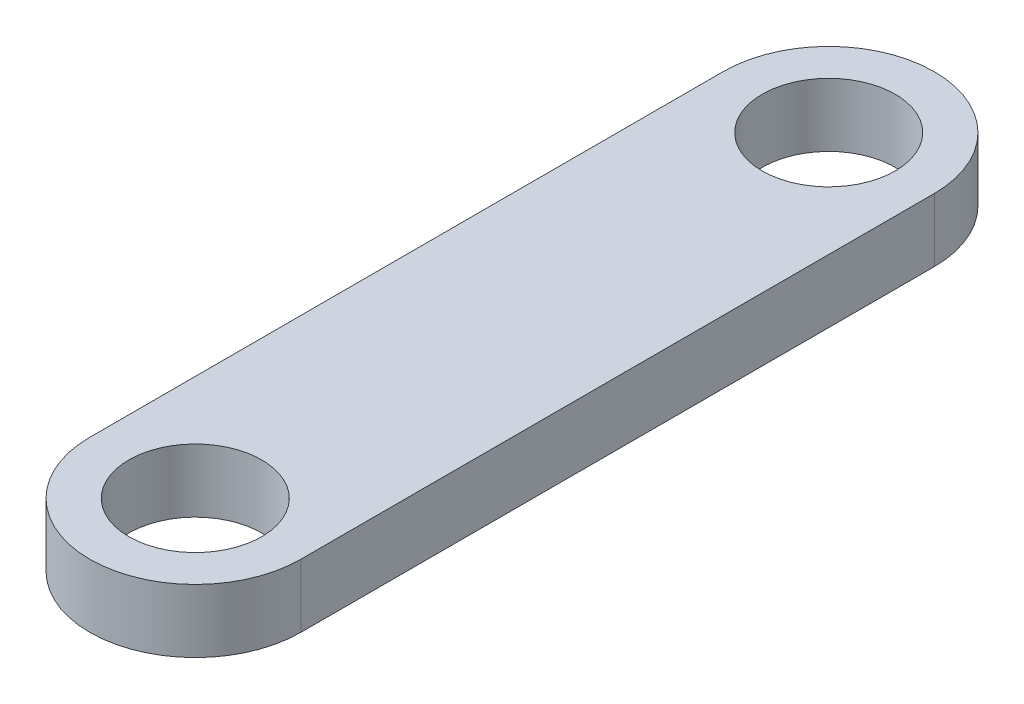
ISO-10303-21;
HEADER;
FILE_DESCRIPTION(('STEP AP214'),'2;1');
FILE_NAME('part.step','',(''),(''),'','','');
FILE_SCHEMA(('AUTOMOTIVE_DESIGN { 1 0 10303 214 1 1 1 1 }'));
ENDSEC;
DATA;
#1=APPLICATION_CONTEXT('core data for automotive mechanical design processes');
#2=APPLICATION_PROTOCOL_DEFINITION('international standard','automotive_design',2000,#1);
#3=PRODUCT_CONTEXT('',#1,'mechanical');
#4=PRODUCT('Part','Part','',(#3));
#5=PRODUCT_RELATED_PRODUCT_CATEGORY('part','',(#4));
#6=PRODUCT_DEFINITION_FORMATION('','',#4);
#7=PRODUCT_DEFINITION_CONTEXT('part definition',#1,'design');
#8=PRODUCT_DEFINITION('design','',#6,#7);
#9=PRODUCT_DEFINITION_SHAPE('','',#8);
#10=(LENGTH_UNIT() NAMED_UNIT(*) SI_UNIT(.MILLI.,.METRE.));
#11=(NAMED_UNIT(*) PLANE_ANGLE_UNIT() SI_UNIT($,.RADIAN.));
#12=(NAMED_UNIT(*) SI_UNIT($,.STERADIAN.) SOLID_ANGLE_UNIT());
#13=UNCERTAINTY_MEASURE_WITH_UNIT(LENGTH_MEASURE(1.E-05),#10,'distance_accuracy_value','');
#14=(GEOMETRIC_REPRESENTATION_CONTEXT(3) GLOBAL_UNCERTAINTY_ASSIGNED_CONTEXT((#13)) GLOBAL_UNIT_ASSIGNED_CONTEXT((#10,
#11,#12)) REPRESENTATION_CONTEXT('',''));
#15=CARTESIAN_POINT('',(0.,0.,0.));
#16=DIRECTION('',(0.,0.,1.));
#17=DIRECTION('',(1.,0.,0.));
#18=AXIS2_PLACEMENT_3D('',#15,#16,#17);
#19=CARTESIAN_POINT('',(0.,-1.905,19.05));
#20=DIRECTION('',(0.,1.,0.));
#21=DIRECTION('',(0.,0.,1.));
#22=AXIS2_PLACEMENT_3D('',#19,#20,#21);
#23=CYLINDRICAL_SURFACE('',#22,3.175);
#24=CARTESIAN_POINT('',(0.,0.,19.05));
#25=DIRECTION('',(0.,1.,0.));
#26=DIRECTION('',(0.,0.,-1.));
#27=AXIS2_PLACEMENT_3D('',#24,#25,#26);
#28=CIRCLE('',#27,3.175);
#29=CARTESIAN_POINT('',(-3.175,0.,19.05));
#30=VERTEX_POINT('',#29);
#31=CARTESIAN_POINT('',(3.175,0.,19.05));
#32=VERTEX_POINT('',#31);
#33=EDGE_CURVE('E110',#30,#32,#28,.T.);
#34=ORIENTED_EDGE('',*,*,#33,.F.);
#35=DIRECTION('',(0.,1.,0.));
#36=VECTOR('',#35,1.);
#37=CARTESIAN_POINT('',(-3.175,-1.905,19.05));
#38=LINE('',#37,#36);
#39=CARTESIAN_POINT('',(-3.175,-1.905,19.05));
#40=VERTEX_POINT('',#39);
#41=EDGE_CURVE('E11',#40,#30,#38,.T.);
#42=ORIENTED_EDGE('',*,*,#41,.F.);
#43=CARTESIAN_POINT('',(0.,-1.905,19.05));
#44=DIRECTION('',(0.,1.,0.));
#45=DIRECTION('',(0.,0.,-1.));
#46=AXIS2_PLACEMENT_3D('',#43,#44,#45);
#47=CIRCLE('',#46,3.175);
#48=CARTESIAN_POINT('',(3.175,-1.905,19.05));
#49=VERTEX_POINT('',#48);
#50=EDGE_CURVE('E101',#40,#49,#47,.T.);
#51=ORIENTED_EDGE('',*,*,#50,.T.);
#52=DIRECTION('',(0.,1.,0.));
#53=VECTOR('',#52,1.);
#54=CARTESIAN_POINT('',(3.175,-1.905,19.05));
#55=LINE('',#54,#53);
#56=EDGE_CURVE('E42',#49,#32,#55,.T.);
#57=ORIENTED_EDGE('',*,*,#56,.T.);
#58=EDGE_LOOP('',(#34,#42,#51,#57));
#59=FACE_BOUND('',#58,.T.);
#60=ADVANCED_FACE('F39',(#59),#23,.T.);
#61=CARTESIAN_POINT('',(-3.175,-1.905,19.05));
#62=DIRECTION('',(-1.,0.,0.));
#63=DIRECTION('',(0.,0.,1.));
#64=AXIS2_PLACEMENT_3D('',#61,#62,#63);
#65=PLANE('',#64);
#66=DIRECTION('',(0.,0.,1.));
#67=VECTOR('',#66,1.);
#68=CARTESIAN_POINT('',(-3.175,0.,19.05));
#69=LINE('',#68,#67);
#70=CARTESIAN_POINT('',(-3.175,0.,0.));
#71=VERTEX_POINT('',#70);
#72=EDGE_CURVE('E104',#71,#30,#69,.T.);
#73=ORIENTED_EDGE('',*,*,#72,.F.);
#74=DIRECTION('',(0.,1.,0.));
#75=VECTOR('',#74,1.);
#76=CARTESIAN_POINT('',(-3.175,-1.905,0.));
#77=LINE('',#76,#75);
#78=CARTESIAN_POINT('',(-3.175,-1.905,0.));
#79=VERTEX_POINT('',#78);
#80=EDGE_CURVE('E49',#79,#71,#77,.T.);
#81=ORIENTED_EDGE('',*,*,#80,.F.);
#82=DIRECTION('',(0.,0.,1.));
#83=VECTOR('',#82,1.);
#84=CARTESIAN_POINT('',(-3.175,-1.905,19.05));
#85=LINE('',#84,#83);
#86=EDGE_CURVE('E96',#79,#40,#85,.T.);
#87=ORIENTED_EDGE('',*,*,#86,.T.);
#88=ORIENTED_EDGE('',*,*,#41,.T.);
#89=EDGE_LOOP('',(#73,#81,#87,#88));
#90=FACE_BOUND('',#89,.T.);
#91=ADVANCED_FACE('F127',(#90),#65,.T.);
#92=CARTESIAN_POINT('',(0.,-1.905,0.));
#93=DIRECTION('',(0.,1.,0.));
#94=DIRECTION('',(0.,0.,1.));
#95=AXIS2_PLACEMENT_3D('',#92,#93,#94);
#96=CYLINDRICAL_SURFACE('',#95,3.175);
#97=CARTESIAN_POINT('',(0.,0.,0.));
#98=DIRECTION('',(0.,1.,0.));
#99=DIRECTION('',(0.,0.,1.));
#100=AXIS2_PLACEMENT_3D('',#97,#98,#99);
#101=CIRCLE('',#100,3.175);
#102=CARTESIAN_POINT('',(3.175,0.,0.));
#103=VERTEX_POINT('',#102);
#104=EDGE_CURVE('E90',#103,#71,#101,.T.);
#105=ORIENTED_EDGE('',*,*,#104,.F.);
#106=DIRECTION('',(0.,1.,0.));
#107=VECTOR('',#106,1.);
#108=CARTESIAN_POINT('',(3.175,-1.905,0.));
#109=LINE('',#108,#107);
#110=CARTESIAN_POINT('',(3.175,-1.905,0.));
#111=VERTEX_POINT('',#110);
#112=EDGE_CURVE('E85',#111,#103,#109,.T.);
#113=ORIENTED_EDGE('',*,*,#112,.F.);
#114=CARTESIAN_POINT('',(0.,-1.905,0.));
#115=DIRECTION('',(0.,1.,0.));
#116=DIRECTION('',(0.,0.,1.));
#117=AXIS2_PLACEMENT_3D('',#114,#115,#116);
#118=CIRCLE('',#117,3.175);
#119=EDGE_CURVE('E88',#111,#79,#118,.T.);
#120=ORIENTED_EDGE('',*,*,#119,.T.);
#121=ORIENTED_EDGE('',*,*,#80,.T.);
#122=EDGE_LOOP('',(#105,#113,#120,#121));
#123=FACE_BOUND('',#122,.T.);
#124=ADVANCED_FACE('F87',(#123),#96,.T.);
#125=CARTESIAN_POINT('',(3.175,-1.905,19.05));
#126=DIRECTION('',(1.,0.,0.));
#127=DIRECTION('',(0.,0.,-1.));
#128=AXIS2_PLACEMENT_3D('',#125,#126,#127);
#129=PLANE('',#128);
#130=DIRECTION('',(0.,0.,-1.));
#131=VECTOR('',#130,1.);
#132=CARTESIAN_POINT('',(3.175,0.,19.05));
#133=LINE('',#132,#131);
#134=EDGE_CURVE('E114',#32,#103,#133,.T.);
#135=ORIENTED_EDGE('',*,*,#134,.F.);
#136=ORIENTED_EDGE('',*,*,#56,.F.);
#137=DIRECTION('',(0.,0.,-1.));
#138=VECTOR('',#137,1.);
#139=CARTESIAN_POINT('',(3.175,-1.905,19.05));
#140=LINE('',#139,#138);
#141=EDGE_CURVE('E95',#49,#111,#140,.T.);
#142=ORIENTED_EDGE('',*,*,#141,.T.);
#143=ORIENTED_EDGE('',*,*,#112,.T.);
#144=EDGE_LOOP('',(#135,#136,#142,#143));
#145=FACE_BOUND('',#144,.T.);
#146=ADVANCED_FACE('F99',(#145),#129,.T.);
#147=CARTESIAN_POINT('',(0.,-1.905,19.05));
#148=DIRECTION('',(0.,-1.,0.));
#149=DIRECTION('',(0.,0.,-1.));
#150=AXIS2_PLACEMENT_3D('',#147,#148,#149);
#151=PLANE('',#150);
#152=CARTESIAN_POINT('',(0.,-1.905,19.05));
#153=DIRECTION('',(0.,1.,0.));
#154=DIRECTION('',(0.,0.,1.));
#155=AXIS2_PLACEMENT_3D('',#152,#153,#154);
#156=CIRCLE('',#155,2.);
#157=CARTESIAN_POINT('',(0.,-1.905,21.05));
#158=VERTEX_POINT('',#157);
#159=EDGE_CURVE('E160',#158,#158,#156,.T.);
#160=ORIENTED_EDGE('',*,*,#159,.T.);
#161=EDGE_LOOP('',(#160));
#162=FACE_BOUND('',#161,.T.);
#163=CARTESIAN_POINT('',(0.,-1.905,0.));
#164=DIRECTION('',(0.,1.,0.));
#165=DIRECTION('',(0.,0.,1.));
#166=AXIS2_PLACEMENT_3D('',#163,#164,#165);
#167=CIRCLE('',#166,2.);
#168=CARTESIAN_POINT('',(0.,-1.905,2.));
#169=VERTEX_POINT('',#168);
#170=EDGE_CURVE('E115',#169,#169,#167,.T.);
#171=ORIENTED_EDGE('',*,*,#170,.T.);
#172=EDGE_LOOP('',(#171));
#173=FACE_BOUND('',#172,.T.);
#174=ORIENTED_EDGE('',*,*,#50,.F.);
#175=ORIENTED_EDGE('',*,*,#86,.F.);
#176=ORIENTED_EDGE('',*,*,#119,.F.);
#177=ORIENTED_EDGE('',*,*,#141,.F.);
#178=EDGE_LOOP('',(#174,#175,#176,#177));
#179=FACE_BOUND('',#178,.T.);
#180=ADVANCED_FACE('F94',(#162,#173,#179),#151,.T.);
#181=CARTESIAN_POINT('',(0.,0.,19.05));
#182=DIRECTION('',(0.,-1.,0.));
#183=DIRECTION('',(0.,0.,-1.));
#184=AXIS2_PLACEMENT_3D('',#181,#182,#183);
#185=PLANE('',#184);
#186=CARTESIAN_POINT('',(0.,0.,19.05));
#187=DIRECTION('',(0.,1.,0.));
#188=DIRECTION('',(0.,0.,1.));
#189=AXIS2_PLACEMENT_3D('',#186,#187,#188);
#190=CIRCLE('',#189,2.);
#191=CARTESIAN_POINT('',(0.,0.,21.05));
#192=VERTEX_POINT('',#191);
#193=EDGE_CURVE('E163',#192,#192,#190,.T.);
#194=ORIENTED_EDGE('',*,*,#193,.F.);
#195=EDGE_LOOP('',(#194));
#196=FACE_BOUND('',#195,.T.);
#197=CARTESIAN_POINT('',(0.,0.,0.));
#198=DIRECTION('',(0.,1.,0.));
#199=DIRECTION('',(0.,0.,1.));
#200=AXIS2_PLACEMENT_3D('',#197,#198,#199);
#201=CIRCLE('',#200,2.);
#202=CARTESIAN_POINT('',(0.,0.,2.));
#203=VERTEX_POINT('',#202);
#204=EDGE_CURVE('E167',#203,#203,#201,.T.);
#205=ORIENTED_EDGE('',*,*,#204,.F.);
#206=EDGE_LOOP('',(#205));
#207=FACE_BOUND('',#206,.T.);
#208=ORIENTED_EDGE('',*,*,#33,.T.);
#209=ORIENTED_EDGE('',*,*,#134,.T.);
#210=ORIENTED_EDGE('',*,*,#104,.T.);
#211=ORIENTED_EDGE('',*,*,#72,.T.);
#212=EDGE_LOOP('',(#208,#209,#210,#211));
#213=FACE_BOUND('',#212,.T.);
#214=ADVANCED_FACE('F126',(#196,#207,#213),#185,.F.);
#215=CARTESIAN_POINT('',(0.,-1.905,0.));
#216=DIRECTION('',(0.,1.,0.));
#217=DIRECTION('',(0.,0.,1.));
#218=AXIS2_PLACEMENT_3D('',#215,#216,#217);
#219=CYLINDRICAL_SURFACE('',#218,2.);
#220=CARTESIAN_POINT('',(0.,-1.905,2.));
#221=CARTESIAN_POINT('',(0.,-1.88515625,2.));
#222=CARTESIAN_POINT('',(0.,-1.8653125,2.));
#223=CARTESIAN_POINT('',(0.,-1.825625,2.));
#224=CARTESIAN_POINT('',(0.,-1.80578125,2.));
#225=CARTESIAN_POINT('',(0.,-1.76609375,2.));
#226=CARTESIAN_POINT('',(0.,-1.74625,2.));
#227=CARTESIAN_POINT('',(0.,-1.7065625,2.));
#228=CARTESIAN_POINT('',(0.,-1.68671875,2.));
#229=CARTESIAN_POINT('',(0.,-1.64703125,2.));
#230=CARTESIAN_POINT('',(0.,-1.6271875,2.));
#231=CARTESIAN_POINT('',(0.,-1.5875,2.));
#232=CARTESIAN_POINT('',(0.,-1.56765625,2.));
#233=CARTESIAN_POINT('',(0.,-1.52796875,2.));
#234=CARTESIAN_POINT('',(0.,-1.508125,2.));
#235=CARTESIAN_POINT('',(0.,-1.4684375,2.));
#236=CARTESIAN_POINT('',(0.,-1.44859375,2.));
#237=CARTESIAN_POINT('',(0.,-1.40890625,2.));
#238=CARTESIAN_POINT('',(0.,-1.3890625,2.));
#239=CARTESIAN_POINT('',(0.,-1.349375,2.));
#240=CARTESIAN_POINT('',(0.,-1.32953125,2.));
#241=CARTESIAN_POINT('',(0.,-1.28984375,2.));
#242=CARTESIAN_POINT('',(0.,-1.27,2.));
#243=CARTESIAN_POINT('',(0.,-1.2303125,2.));
#244=CARTESIAN_POINT('',(0.,-1.21046875,2.));
#245=CARTESIAN_POINT('',(0.,-1.17078125,2.));
#246=CARTESIAN_POINT('',(0.,-1.1509375,2.));
#247=CARTESIAN_POINT('',(0.,-1.11125,2.));
#248=CARTESIAN_POINT('',(0.,-1.09140625,2.));
#249=CARTESIAN_POINT('',(0.,-1.05171875,2.));
#250=CARTESIAN_POINT('',(0.,-1.031875,2.));
#251=CARTESIAN_POINT('',(0.,-0.9921875,2.));
#252=CARTESIAN_POINT('',(0.,-0.97234375,2.));
#253=CARTESIAN_POINT('',(0.,-0.93265625,2.));
#254=CARTESIAN_POINT('',(0.,-0.9128125,2.));
#255=CARTESIAN_POINT('',(0.,-0.873125,2.));
#256=CARTESIAN_POINT('',(0.,-0.85328125,2.));
#257=CARTESIAN_POINT('',(0.,-0.81359375,2.));
#258=CARTESIAN_POINT('',(0.,-0.79375,2.));
#259=CARTESIAN_POINT('',(0.,-0.7540625,2.));
#260=CARTESIAN_POINT('',(0.,-0.73421875,2.));
#261=CARTESIAN_POINT('',(0.,-0.69453125,2.));
#262=CARTESIAN_POINT('',(0.,-0.6746875,2.));
#263=CARTESIAN_POINT('',(0.,-0.635,2.));
#264=CARTESIAN_POINT('',(0.,-0.61515625,2.));
#265=CARTESIAN_POINT('',(0.,-0.57546875,2.));
#266=CARTESIAN_POINT('',(0.,-0.555625,2.));
#267=CARTESIAN_POINT('',(0.,-0.5159375,2.));
#268=CARTESIAN_POINT('',(0.,-0.49609375,2.));
#269=CARTESIAN_POINT('',(0.,-0.45640625,2.));
#270=CARTESIAN_POINT('',(0.,-0.4365625,2.));
#271=CARTESIAN_POINT('',(0.,-0.396875,2.));
#272=CARTESIAN_POINT('',(0.,-0.37703125,2.));
#273=CARTESIAN_POINT('',(0.,-0.33734375,2.));
#274=CARTESIAN_POINT('',(0.,-0.3175,2.));
#275=CARTESIAN_POINT('',(0.,-0.2778125,2.));
#276=CARTESIAN_POINT('',(0.,-0.25796875,2.));
#277=CARTESIAN_POINT('',(0.,-0.21828125,2.));
#278=CARTESIAN_POINT('',(0.,-0.1984375,2.));
#279=CARTESIAN_POINT('',(0.,-0.15875,2.));
#280=CARTESIAN_POINT('',(0.,-0.13890625,2.));
#281=CARTESIAN_POINT('',(0.,-0.09921875,2.));
#282=CARTESIAN_POINT('',(0.,-0.0793749999999999,2.));
#283=CARTESIAN_POINT('',(0.,-0.0396874999999999,2.));
#284=CARTESIAN_POINT('',(0.,-0.01984375,2.));
#285=CARTESIAN_POINT('',(0.,0.,2.));
#286=B_SPLINE_CURVE_WITH_KNOTS('',3,(#220,#221,#222,#223,#224,#225,#226,#227,#228,#229,#230,
#231,#232,#233,#234,#235,#236,#237,#238,#239,#240,#241,#242,#243,#244,#245,#246,#247,#248,#249,
#250,#251,#252,#253,#254,#255,#256,#257,#258,#259,#260,#261,#262,#263,#264,#265,#266,#267,#268,
#269,#270,#271,#272,#273,#274,#275,#276,#277,#278,#279,#280,#281,#282,#283,#284,#285),
.UNSPECIFIED.,.F.,.F.,(4,2,2,2,2,2,2,2,2,2,2,2,2,2,2,2,2,2,2,2,2,2,2,2,2,2,2,2,2,2,2,2,4),(0.,
0.0595312500000001,0.1190625,0.17859375,0.238125,0.29765625,0.3571875,0.41671875,0.47625,
0.53578125,0.5953125,0.65484375,0.714375,0.77390625,0.8334375,0.89296875,0.9525,1.01203125,
1.0715625,1.13109375,1.190625,1.25015625,1.3096875,1.36921875,1.42875,1.48828125,1.5478125,
1.60734375,1.666875,1.72640625,1.7859375,1.84546875,1.905),.UNSPECIFIED.);
#287=EDGE_CURVE('BSEAM145',#169,#203,#286,.T.);
#288=ORIENTED_EDGE('',*,*,#170,.F.);
#289=ORIENTED_EDGE('',*,*,#204,.T.);
#290=ORIENTED_EDGE('',*,*,#287,.T.);
#291=ORIENTED_EDGE('',*,*,#287,.F.);
#292=EDGE_LOOP('',(#288,#290,#289,#291));
#293=FACE_BOUND('',#292,.T.);
#294=ADVANCED_FACE('F145',(#293),#219,.F.);
#295=CARTESIAN_POINT('',(0.,-1.905,19.05));
#296=DIRECTION('',(0.,1.,0.));
#297=DIRECTION('',(0.,0.,1.));
#298=AXIS2_PLACEMENT_3D('',#295,#296,#297);
#299=CYLINDRICAL_SURFACE('',#298,2.);
#300=CARTESIAN_POINT('',(0.,-1.905,21.05));
#301=CARTESIAN_POINT('',(0.,-1.88515625,21.05));
#302=CARTESIAN_POINT('',(0.,-1.8653125,21.05));
#303=CARTESIAN_POINT('',(0.,-1.825625,21.05));
#304=CARTESIAN_POINT('',(0.,-1.80578125,21.05));
#305=CARTESIAN_POINT('',(0.,-1.76609375,21.05));
#306=CARTESIAN_POINT('',(0.,-1.74625,21.05));
#307=CARTESIAN_POINT('',(0.,-1.7065625,21.05));
#308=CARTESIAN_POINT('',(0.,-1.68671875,21.05));
#309=CARTESIAN_POINT('',(0.,-1.64703125,21.05));
#310=CARTESIAN_POINT('',(0.,-1.6271875,21.05));
#311=CARTESIAN_POINT('',(0.,-1.5875,21.05));
#312=CARTESIAN_POINT('',(0.,-1.56765625,21.05));
#313=CARTESIAN_POINT('',(0.,-1.52796875,21.05));
#314=CARTESIAN_POINT('',(0.,-1.508125,21.05));
#315=CARTESIAN_POINT('',(0.,-1.4684375,21.05));
#316=CARTESIAN_POINT('',(0.,-1.44859375,21.05));
#317=CARTESIAN_POINT('',(0.,-1.40890625,21.05));
#318=CARTESIAN_POINT('',(0.,-1.3890625,21.05));
#319=CARTESIAN_POINT('',(0.,-1.349375,21.05));
#320=CARTESIAN_POINT('',(0.,-1.32953125,21.05));
#321=CARTESIAN_POINT('',(0.,-1.28984375,21.05));
#322=CARTESIAN_POINT('',(0.,-1.27,21.05));
#323=CARTESIAN_POINT('',(0.,-1.2303125,21.05));
#324=CARTESIAN_POINT('',(0.,-1.21046875,21.05));
#325=CARTESIAN_POINT('',(0.,-1.17078125,21.05));
#326=CARTESIAN_POINT('',(0.,-1.1509375,21.05));
#327=CARTESIAN_POINT('',(0.,-1.11125,21.05));
#328=CARTESIAN_POINT('',(0.,-1.09140625,21.05));
#329=CARTESIAN_POINT('',(0.,-1.05171875,21.05));
#330=CARTESIAN_POINT('',(0.,-1.031875,21.05));
#331=CARTESIAN_POINT('',(0.,-0.9921875,21.05));
#332=CARTESIAN_POINT('',(0.,-0.97234375,21.05));
#333=CARTESIAN_POINT('',(0.,-0.93265625,21.05));
#334=CARTESIAN_POINT('',(0.,-0.9128125,21.05));
#335=CARTESIAN_POINT('',(0.,-0.873125,21.05));
#336=CARTESIAN_POINT('',(0.,-0.85328125,21.05));
#337=CARTESIAN_POINT('',(0.,-0.81359375,21.05));
#338=CARTESIAN_POINT('',(0.,-0.79375,21.05));
#339=CARTESIAN_POINT('',(0.,-0.7540625,21.05));
#340=CARTESIAN_POINT('',(0.,-0.73421875,21.05));
#341=CARTESIAN_POINT('',(0.,-0.69453125,21.05));
#342=CARTESIAN_POINT('',(0.,-0.6746875,21.05));
#343=CARTESIAN_POINT('',(0.,-0.635,21.05));
#344=CARTESIAN_POINT('',(0.,-0.61515625,21.05));
#345=CARTESIAN_POINT('',(0.,-0.57546875,21.05));
#346=CARTESIAN_POINT('',(0.,-0.555625,21.05));
#347=CARTESIAN_POINT('',(0.,-0.5159375,21.05));
#348=CARTESIAN_POINT('',(0.,-0.49609375,21.05));
#349=CARTESIAN_POINT('',(0.,-0.45640625,21.05));
#350=CARTESIAN_POINT('',(0.,-0.4365625,21.05));
#351=CARTESIAN_POINT('',(0.,-0.396875,21.05));
#352=CARTESIAN_POINT('',(0.,-0.37703125,21.05));
#353=CARTESIAN_POINT('',(0.,-0.33734375,21.05));
#354=CARTESIAN_POINT('',(0.,-0.3175,21.05));
#355=CARTESIAN_POINT('',(0.,-0.2778125,21.05));
#356=CARTESIAN_POINT('',(0.,-0.25796875,21.05));
#357=CARTESIAN_POINT('',(0.,-0.21828125,21.05));
#358=CARTESIAN_POINT('',(0.,-0.1984375,21.05));
#359=CARTESIAN_POINT('',(0.,-0.15875,21.05));
#360=CARTESIAN_POINT('',(0.,-0.13890625,21.05));
#361=CARTESIAN_POINT('',(0.,-0.09921875,21.05));
#362=CARTESIAN_POINT('',(0.,-0.0793749999999999,21.05));
#363=CARTESIAN_POINT('',(0.,-0.0396874999999999,21.05));
#364=CARTESIAN_POINT('',(0.,-0.01984375,21.05));
#365=CARTESIAN_POINT('',(0.,0.,21.05));
#366=B_SPLINE_CURVE_WITH_KNOTS('',3,(#300,#301,#302,#303,#304,#305,#306,#307,#308,#309,#310,
#311,#312,#313,#314,#315,#316,#317,#318,#319,#320,#321,#322,#323,#324,#325,#326,#327,#328,#329,
#330,#331,#332,#333,#334,#335,#336,#337,#338,#339,#340,#341,#342,#343,#344,#345,#346,#347,#348,
#349,#350,#351,#352,#353,#354,#355,#356,#357,#358,#359,#360,#361,#362,#363,#364,#365),
.UNSPECIFIED.,.F.,.F.,(4,2,2,2,2,2,2,2,2,2,2,2,2,2,2,2,2,2,2,2,2,2,2,2,2,2,2,2,2,2,2,2,4),(0.,
0.0595312500000001,0.1190625,0.17859375,0.238125,0.29765625,0.3571875,0.41671875,0.47625,
0.53578125,0.5953125,0.65484375,0.714375,0.77390625,0.8334375,0.89296875,0.9525,1.01203125,
1.0715625,1.13109375,1.190625,1.25015625,1.3096875,1.36921875,1.42875,1.48828125,1.5478125,
1.60734375,1.666875,1.72640625,1.7859375,1.84546875,1.905),.UNSPECIFIED.);
#367=EDGE_CURVE('BSEAM152',#158,#192,#366,.T.);
#368=ORIENTED_EDGE('',*,*,#159,.F.);
#369=ORIENTED_EDGE('',*,*,#193,.T.);
#370=ORIENTED_EDGE('',*,*,#367,.T.);
#371=ORIENTED_EDGE('',*,*,#367,.F.);
#372=EDGE_LOOP('',(#368,#370,#369,#371));
#373=FACE_BOUND('',#372,.T.);
#374=ADVANCED_FACE('F152',(#373),#299,.F.);
#375=CLOSED_SHELL('',(#60,#91,#124,#146,#180,#214,#294,#374));
#376=MANIFOLD_SOLID_BREP('B2',#375);
#377=ADVANCED_BREP_SHAPE_REPRESENTATION('',(#18,#376),#14);
#378=SHAPE_DEFINITION_REPRESENTATION(#9,#377);
ENDSEC;
END-ISO-10303-21;
